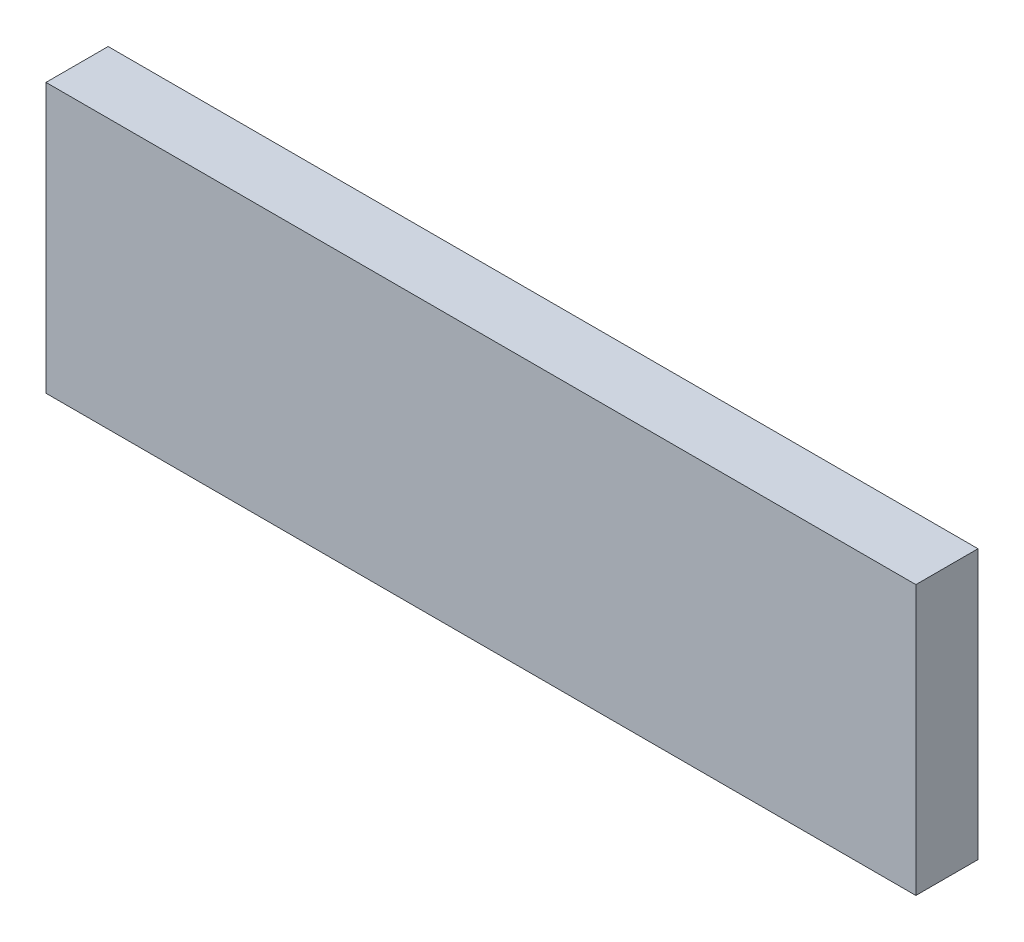
ISO-10303-21;
HEADER;
FILE_DESCRIPTION(('STEP AP214'),'2;1');
FILE_NAME('part.step','',(''),(''),'','','');
FILE_SCHEMA(('AUTOMOTIVE_DESIGN { 1 0 10303 214 1 1 1 1 }'));
ENDSEC;
DATA;
#1=APPLICATION_CONTEXT('core data for automotive mechanical design processes');
#2=APPLICATION_PROTOCOL_DEFINITION('international standard','automotive_design',2000,#1);
#3=PRODUCT_CONTEXT('',#1,'mechanical');
#4=PRODUCT('Part','Part','',(#3));
#5=PRODUCT_RELATED_PRODUCT_CATEGORY('part','',(#4));
#6=PRODUCT_DEFINITION_FORMATION('','',#4);
#7=PRODUCT_DEFINITION_CONTEXT('part definition',#1,'design');
#8=PRODUCT_DEFINITION('design','',#6,#7);
#9=PRODUCT_DEFINITION_SHAPE('','',#8);
#10=(LENGTH_UNIT() NAMED_UNIT(*) SI_UNIT(.MILLI.,.METRE.));
#11=(NAMED_UNIT(*) PLANE_ANGLE_UNIT() SI_UNIT($,.RADIAN.));
#12=(NAMED_UNIT(*) SI_UNIT($,.STERADIAN.) SOLID_ANGLE_UNIT());
#13=UNCERTAINTY_MEASURE_WITH_UNIT(LENGTH_MEASURE(1.E-05),#10,'distance_accuracy_value','');
#14=(GEOMETRIC_REPRESENTATION_CONTEXT(3) GLOBAL_UNCERTAINTY_ASSIGNED_CONTEXT((#13)) GLOBAL_UNIT_ASSIGNED_CONTEXT((#10,
#11,#12)) REPRESENTATION_CONTEXT('',''));
#15=CARTESIAN_POINT('',(0.,0.,0.));
#16=DIRECTION('',(0.,0.,1.));
#17=DIRECTION('',(1.,0.,0.));
#18=AXIS2_PLACEMENT_3D('',#15,#16,#17);
#19=CARTESIAN_POINT('',(0.,0.,3.));
#20=DIRECTION('',(1.,0.,0.));
#21=DIRECTION('',(0.,0.,-1.));
#22=AXIS2_PLACEMENT_3D('',#19,#20,#21);
#23=PLANE('',#22);
#24=DIRECTION('',(0.,-1.,0.));
#25=VECTOR('',#24,1.);
#26=CARTESIAN_POINT('',(0.,0.,0.));
#27=LINE('',#26,#25);
#28=CARTESIAN_POINT('',(0.,13.,0.));
#29=VERTEX_POINT('',#28);
#30=CARTESIAN_POINT('',(0.,0.,0.));
#31=VERTEX_POINT('',#30);
#32=EDGE_CURVE('E98',#29,#31,#27,.T.);
#33=ORIENTED_EDGE('',*,*,#32,.T.);
#34=DIRECTION('',(0.,0.,-1.));
#35=VECTOR('',#34,1.);
#36=CARTESIAN_POINT('',(0.,0.,3.));
#37=LINE('',#36,#35);
#38=CARTESIAN_POINT('',(0.,0.,3.));
#39=VERTEX_POINT('',#38);
#40=EDGE_CURVE('E11',#39,#31,#37,.T.);
#41=ORIENTED_EDGE('',*,*,#40,.F.);
#42=DIRECTION('',(0.,-1.,0.));
#43=VECTOR('',#42,1.);
#44=CARTESIAN_POINT('',(0.,0.,3.));
#45=LINE('',#44,#43);
#46=CARTESIAN_POINT('',(0.,13.,3.));
#47=VERTEX_POINT('',#46);
#48=EDGE_CURVE('E86',#47,#39,#45,.T.);
#49=ORIENTED_EDGE('',*,*,#48,.F.);
#50=DIRECTION('',(0.,0.,-1.));
#51=VECTOR('',#50,1.);
#52=CARTESIAN_POINT('',(0.,13.,3.));
#53=LINE('',#52,#51);
#54=EDGE_CURVE('E94',#47,#29,#53,.T.);
#55=ORIENTED_EDGE('',*,*,#54,.T.);
#56=EDGE_LOOP('',(#33,#41,#49,#55));
#57=FACE_BOUND('',#56,.T.);
#58=ADVANCED_FACE('F35',(#57),#23,.F.);
#59=CARTESIAN_POINT('',(0.,0.,3.));
#60=DIRECTION('',(0.,1.,0.));
#61=DIRECTION('',(0.,0.,1.));
#62=AXIS2_PLACEMENT_3D('',#59,#60,#61);
#63=PLANE('',#62);
#64=DIRECTION('',(1.,0.,0.));
#65=VECTOR('',#64,1.);
#66=CARTESIAN_POINT('',(0.,0.,0.));
#67=LINE('',#66,#65);
#68=CARTESIAN_POINT('',(42.,0.,0.));
#69=VERTEX_POINT('',#68);
#70=EDGE_CURVE('E90',#31,#69,#67,.T.);
#71=ORIENTED_EDGE('',*,*,#70,.T.);
#72=DIRECTION('',(0.,0.,-1.));
#73=VECTOR('',#72,1.);
#74=CARTESIAN_POINT('',(42.,0.,3.));
#75=LINE('',#74,#73);
#76=CARTESIAN_POINT('',(42.,0.,3.));
#77=VERTEX_POINT('',#76);
#78=EDGE_CURVE('E43',#77,#69,#75,.T.);
#79=ORIENTED_EDGE('',*,*,#78,.F.);
#80=DIRECTION('',(1.,0.,0.));
#81=VECTOR('',#80,1.);
#82=CARTESIAN_POINT('',(0.,0.,3.));
#83=LINE('',#82,#81);
#84=EDGE_CURVE('E81',#39,#77,#83,.T.);
#85=ORIENTED_EDGE('',*,*,#84,.F.);
#86=ORIENTED_EDGE('',*,*,#40,.T.);
#87=EDGE_LOOP('',(#71,#79,#85,#86));
#88=FACE_BOUND('',#87,.T.);
#89=ADVANCED_FACE('F89',(#88),#63,.F.);
#90=CARTESIAN_POINT('',(42.,0.,3.));
#91=DIRECTION('',(-1.,0.,0.));
#92=DIRECTION('',(0.,0.,1.));
#93=AXIS2_PLACEMENT_3D('',#90,#91,#92);
#94=PLANE('',#93);
#95=DIRECTION('',(0.,1.,0.));
#96=VECTOR('',#95,1.);
#97=CARTESIAN_POINT('',(42.,0.,0.));
#98=LINE('',#97,#96);
#99=CARTESIAN_POINT('',(42.,13.,0.));
#100=VERTEX_POINT('',#99);
#101=EDGE_CURVE('E68',#69,#100,#98,.T.);
#102=ORIENTED_EDGE('',*,*,#101,.T.);
#103=DIRECTION('',(0.,0.,-1.));
#104=VECTOR('',#103,1.);
#105=CARTESIAN_POINT('',(42.,13.,3.));
#106=LINE('',#105,#104);
#107=CARTESIAN_POINT('',(42.,13.,3.));
#108=VERTEX_POINT('',#107);
#109=EDGE_CURVE('E91',#108,#100,#106,.T.);
#110=ORIENTED_EDGE('',*,*,#109,.F.);
#111=DIRECTION('',(0.,1.,0.));
#112=VECTOR('',#111,1.);
#113=CARTESIAN_POINT('',(42.,0.,3.));
#114=LINE('',#113,#112);
#115=EDGE_CURVE('E84',#77,#108,#114,.T.);
#116=ORIENTED_EDGE('',*,*,#115,.F.);
#117=ORIENTED_EDGE('',*,*,#78,.T.);
#118=EDGE_LOOP('',(#102,#110,#116,#117));
#119=FACE_BOUND('',#118,.T.);
#120=ADVANCED_FACE('F92',(#119),#94,.F.);
#121=CARTESIAN_POINT('',(0.,13.,3.));
#122=DIRECTION('',(0.,-1.,0.));
#123=DIRECTION('',(0.,0.,-1.));
#124=AXIS2_PLACEMENT_3D('',#121,#122,#123);
#125=PLANE('',#124);
#126=DIRECTION('',(-1.,0.,0.));
#127=VECTOR('',#126,1.);
#128=CARTESIAN_POINT('',(0.,13.,0.));
#129=LINE('',#128,#127);
#130=EDGE_CURVE('E74',#100,#29,#129,.T.);
#131=ORIENTED_EDGE('',*,*,#130,.T.);
#132=ORIENTED_EDGE('',*,*,#54,.F.);
#133=DIRECTION('',(-1.,0.,0.));
#134=VECTOR('',#133,1.);
#135=CARTESIAN_POINT('',(0.,13.,3.));
#136=LINE('',#135,#134);
#137=EDGE_CURVE('E51',#108,#47,#136,.T.);
#138=ORIENTED_EDGE('',*,*,#137,.F.);
#139=ORIENTED_EDGE('',*,*,#109,.T.);
#140=EDGE_LOOP('',(#131,#132,#138,#139));
#141=FACE_BOUND('',#140,.T.);
#142=ADVANCED_FACE('F105',(#141),#125,.F.);
#143=CARTESIAN_POINT('',(0.,0.,3.));
#144=DIRECTION('',(0.,0.,-1.));
#145=DIRECTION('',(-1.,0.,0.));
#146=AXIS2_PLACEMENT_3D('',#143,#144,#145);
#147=PLANE('',#146);
#148=ORIENTED_EDGE('',*,*,#48,.T.);
#149=ORIENTED_EDGE('',*,*,#84,.T.);
#150=ORIENTED_EDGE('',*,*,#115,.T.);
#151=ORIENTED_EDGE('',*,*,#137,.T.);
#152=EDGE_LOOP('',(#148,#149,#150,#151));
#153=FACE_BOUND('',#152,.T.);
#154=ADVANCED_FACE('F82',(#153),#147,.F.);
#155=CARTESIAN_POINT('',(0.,0.,0.));
#156=DIRECTION('',(0.,0.,-1.));
#157=DIRECTION('',(-1.,0.,0.));
#158=AXIS2_PLACEMENT_3D('',#155,#156,#157);
#159=PLANE('',#158);
#160=ORIENTED_EDGE('',*,*,#32,.F.);
#161=ORIENTED_EDGE('',*,*,#130,.F.);
#162=ORIENTED_EDGE('',*,*,#101,.F.);
#163=ORIENTED_EDGE('',*,*,#70,.F.);
#164=EDGE_LOOP('',(#160,#161,#162,#163));
#165=FACE_BOUND('',#164,.T.);
#166=ADVANCED_FACE('F108',(#165),#159,.T.);
#167=CLOSED_SHELL('',(#58,#89,#120,#142,#154,#166));
#168=MANIFOLD_SOLID_BREP('B2',#167);
#169=ADVANCED_BREP_SHAPE_REPRESENTATION('',(#18,#168),#14);
#170=SHAPE_DEFINITION_REPRESENTATION(#9,#169);
ENDSEC;
END-ISO-10303-21;
